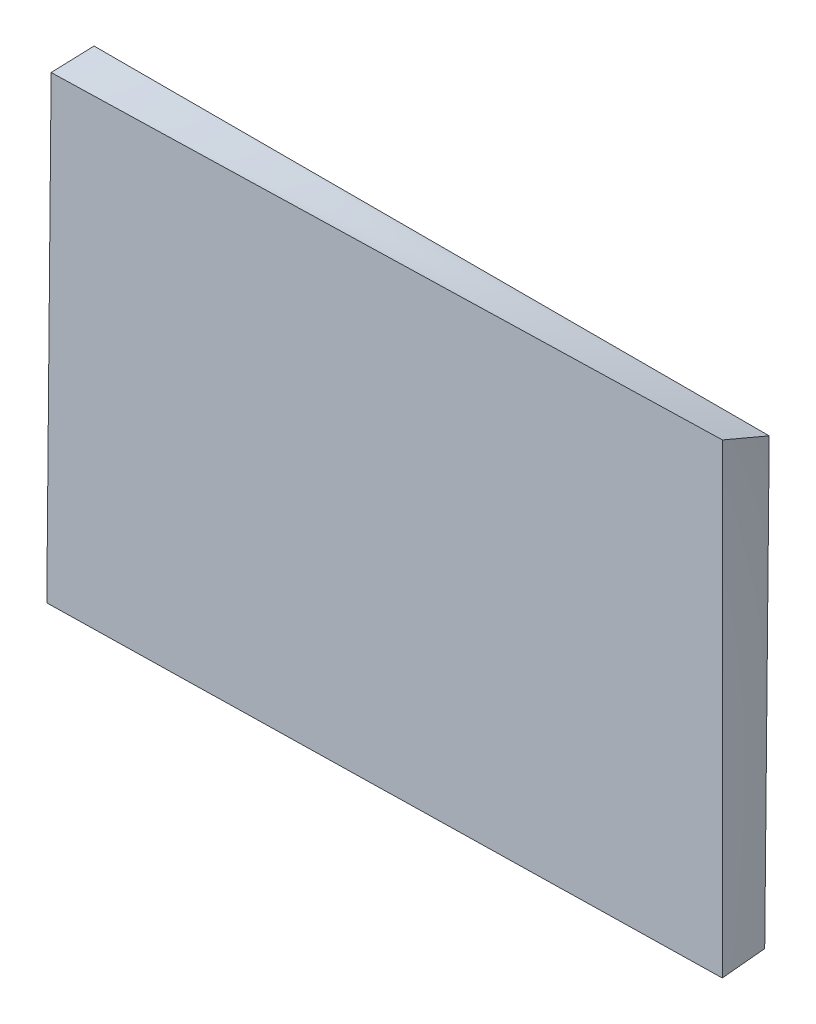
ISO-10303-21;
HEADER;
FILE_DESCRIPTION(('STEP AP214'),'2;1');
FILE_NAME('part.step','',(''),(''),'','','');
FILE_SCHEMA(('AUTOMOTIVE_DESIGN { 1 0 10303 214 1 1 1 1 }'));
ENDSEC;
DATA;
#1=APPLICATION_CONTEXT('core data for automotive mechanical design processes');
#2=APPLICATION_PROTOCOL_DEFINITION('international standard','automotive_design',2000,#1);
#3=PRODUCT_CONTEXT('',#1,'mechanical');
#4=PRODUCT('Part','Part','',(#3));
#5=PRODUCT_RELATED_PRODUCT_CATEGORY('part','',(#4));
#6=PRODUCT_DEFINITION_FORMATION('','',#4);
#7=PRODUCT_DEFINITION_CONTEXT('part definition',#1,'design');
#8=PRODUCT_DEFINITION('design','',#6,#7);
#9=PRODUCT_DEFINITION_SHAPE('','',#8);
#10=(LENGTH_UNIT() NAMED_UNIT(*) SI_UNIT(.MILLI.,.METRE.));
#11=(NAMED_UNIT(*) PLANE_ANGLE_UNIT() SI_UNIT($,.RADIAN.));
#12=(NAMED_UNIT(*) SI_UNIT($,.STERADIAN.) SOLID_ANGLE_UNIT());
#13=UNCERTAINTY_MEASURE_WITH_UNIT(LENGTH_MEASURE(1.E-05),#10,'distance_accuracy_value','');
#14=(GEOMETRIC_REPRESENTATION_CONTEXT(3) GLOBAL_UNCERTAINTY_ASSIGNED_CONTEXT((#13)) GLOBAL_UNIT_ASSIGNED_CONTEXT((#10,
#11,#12)) REPRESENTATION_CONTEXT('',''));
#15=CARTESIAN_POINT('',(0.,0.,0.));
#16=DIRECTION('',(0.,0.,1.));
#17=DIRECTION('',(1.,0.,0.));
#18=AXIS2_PLACEMENT_3D('',#15,#16,#17);
#19=CARTESIAN_POINT('',(0.,0.0697989934050091,1.99878165403819));
#20=DIRECTION('',(0.,0.0348994967025045,0.999390827019096));
#21=DIRECTION('',(0.,-0.999390827019096,0.0348994967025045));
#22=AXIS2_PLACEMENT_3D('',#19,#20,#21);
#23=PLANE('',#22);
#24=DIRECTION('',(0.999684026786742,0.0251212462704244,-0.000877253250355004));
#25=VECTOR('',#24,1.);
#26=CARTESIAN_POINT('',(14.6511823235174,10.4348141769099,1.63682734803652));
#27=LINE('',#26,#25);
#28=CARTESIAN_POINT('',(-15.2488176764825,9.68345150294578,1.66306551077872));
#29=VERTEX_POINT('',#28);
#30=CARTESIAN_POINT('',(14.6511823235174,10.4348141769099,1.63682734803652));
#31=VERTEX_POINT('',#30);
#32=EDGE_CURVE('E127',#29,#31,#27,.T.);
#33=ORIENTED_EDGE('',*,*,#32,.F.);
#34=DIRECTION('',(-0.0251365587828712,0.999075046288182,-0.0348884693963903));
#35=VECTOR('',#34,1.);
#36=CARTESIAN_POINT('',(-15.2488176764826,9.68345150294578,1.66306551077872));
#37=LINE('',#36,#35);
#38=CARTESIAN_POINT('',(-14.7486001567034,-10.198141918189,2.35734605176689));
#39=VERTEX_POINT('',#38);
#40=EDGE_CURVE('E125',#39,#29,#37,.T.);
#41=ORIENTED_EDGE('',*,*,#40,.F.);
#42=DIRECTION('',(-0.999828427454217,-0.0185120973469246,0.000646456684260813));
#43=VECTOR('',#42,1.);
#44=CARTESIAN_POINT('',(-14.7486001567034,-10.198141918189,2.35734605176689));
#45=LINE('',#44,#43);
#46=CARTESIAN_POINT('',(15.3462355096685,-9.6409277880466,2.33788770557064));
#47=VERTEX_POINT('',#46);
#48=EDGE_CURVE('E61',#47,#39,#45,.T.);
#49=ORIENTED_EDGE('',*,*,#48,.F.);
#50=DIRECTION('',(0.034579760505029,-0.9987931325849,0.0348786247529415));
#51=VECTOR('',#50,1.);
#52=CARTESIAN_POINT('',(15.3462355096685,-9.6409277880466,2.33788770557064));
#53=LINE('',#52,#51);
#54=EDGE_CURVE('E12',#31,#47,#53,.T.);
#55=ORIENTED_EDGE('',*,*,#54,.F.);
#56=EDGE_LOOP('',(#33,#41,#49,#55));
#57=FACE_BOUND('',#56,.T.);
#58=ADVANCED_FACE('F51',(#57),#23,.T.);
#59=CARTESIAN_POINT('',(0.,0.,0.));
#60=DIRECTION('',(0.,0.,1.));
#61=DIRECTION('',(1.,0.,0.));
#62=AXIS2_PLACEMENT_3D('',#59,#60,#61);
#63=PLANE('',#62);
#64=DIRECTION('',(-1.,0.,0.));
#65=VECTOR('',#64,1.);
#66=CARTESIAN_POINT('',(15.1001689223314,9.9997470367077,0.));
#67=LINE('',#66,#65);
#68=CARTESIAN_POINT('',(15.1001689223314,9.9997470367077,0.));
#69=VERTEX_POINT('',#68);
#70=CARTESIAN_POINT('',(-14.9998310776686,9.9997470367077,0.));
#71=VERTEX_POINT('',#70);
#72=EDGE_CURVE('E100',#69,#71,#67,.T.);
#73=ORIENTED_EDGE('',*,*,#72,.F.);
#74=DIRECTION('',(0.0100842054937449,0.999949153107077,0.));
#75=VECTOR('',#74,1.);
#76=CARTESIAN_POINT('',(14.8994932330058,-9.89924111012312,0.));
#77=LINE('',#76,#75);
#78=CARTESIAN_POINT('',(14.8994932330058,-9.89924111012312,0.));
#79=VERTEX_POINT('',#78);
#80=EDGE_CURVE('E226',#79,#69,#77,.T.);
#81=ORIENTED_EDGE('',*,*,#80,.F.);
#82=DIRECTION('',(0.999977401694796,0.00672280445381868,0.));
#83=VECTOR('',#82,1.);
#84=CARTESIAN_POINT('',(-14.9998310776686,-10.1002529632923,0.));
#85=LINE('',#84,#83);
#86=CARTESIAN_POINT('',(-14.9998310776686,-10.1002529632923,0.));
#87=VERTEX_POINT('',#86);
#88=EDGE_CURVE('E102',#87,#79,#85,.T.);
#89=ORIENTED_EDGE('',*,*,#88,.F.);
#90=DIRECTION('',(0.,-1.,0.));
#91=VECTOR('',#90,1.);
#92=CARTESIAN_POINT('',(-14.9998310776686,9.9997470367077,0.));
#93=LINE('',#92,#91);
#94=EDGE_CURVE('E96',#71,#87,#93,.T.);
#95=ORIENTED_EDGE('',*,*,#94,.F.);
#96=EDGE_LOOP('',(#73,#81,#89,#95));
#97=FACE_BOUND('',#96,.T.);
#98=ADVANCED_FACE('F99',(#97),#63,.F.);
#99=CARTESIAN_POINT('',(-14.9998310776686,-10.1002529632923,0.));
#100=CARTESIAN_POINT('',(-14.7486001567034,-10.198141918189,2.35734605176689));
#101=CARTESIAN_POINT('',(-10.0166103592228,-10.0667509877641,0.));
#102=CARTESIAN_POINT('',(-9.73279421230807,-10.1052728964986,2.35410299406751));
#103=CARTESIAN_POINT('',(-5.03338964077709,-10.0332490122359,0.));
#104=CARTESIAN_POINT('',(-4.71698826791273,-10.0124038748082,2.35085993636814));
#105=CARTESIAN_POINT('',(4.93305179611438,-9.96624506117951,0.));
#106=CARTESIAN_POINT('',(5.31462362087791,-9.82666583142741,2.34437382096939));
#107=CARTESIAN_POINT('',(9.9162725145601,-9.93274308565131,0.));
#108=CARTESIAN_POINT('',(10.3304295652732,-9.73379680973701,2.34113076327001));
#109=CARTESIAN_POINT('',(14.8994932330058,-9.89924111012312,0.));
#110=CARTESIAN_POINT('',(15.3462355096685,-9.6409277880466,2.33788770557064));
#111=B_SPLINE_SURFACE_WITH_KNOTS('',3,1,((#99,#100),(#101,#102),(#103,#104),(#105,#106),(#107,
#108),(#109,#110)),.UNSPECIFIED.,.F.,.F.,.F.,(4,2,4),(2,2),(0.,0.5,1.),(0.,1.),.UNSPECIFIED.);
#112=DIRECTION('',(0.186596321247656,0.107892890703808,0.97649420737269));
#113=VECTOR('',#112,1.);
#114=CARTESIAN_POINT('',(15.1228643713372,-9.77008444908486,1.16894385278532));
#115=LINE('',#114,#113);
#116=EDGE_CURVE('E76',#79,#47,#115,.T.);
#117=DIRECTION('',(-0.105883281584117,0.0412560831902713,-0.993522353186266));
#118=VECTOR('',#117,1.);
#119=CARTESIAN_POINT('',(-14.874215617186,-10.1491974407407,1.17867302588344));
#120=LINE('',#119,#118);
#121=EDGE_CURVE('E140',#39,#87,#120,.T.);
#122=ORIENTED_EDGE('',*,*,#88,.T.);
#123=ORIENTED_EDGE('',*,*,#116,.T.);
#124=ORIENTED_EDGE('',*,*,#48,.T.);
#125=ORIENTED_EDGE('',*,*,#121,.T.);
#126=EDGE_LOOP('',(#122,#123,#124,#125));
#127=FACE_BOUND('',#126,.T.);
#128=ADVANCED_FACE('F181',(#127),#111,.T.);
#129=CARTESIAN_POINT('',(14.8994932330058,-9.89924111012312,0.));
#130=CARTESIAN_POINT('',(15.3462355096685,-9.6409277880466,2.33788770557064));
#131=CARTESIAN_POINT('',(14.9329391812268,-6.58274308565131,0.));
#132=CARTESIAN_POINT('',(15.2303933119767,-6.29497079388718,2.22104431264829));
#133=CARTESIAN_POINT('',(14.9663851294477,-3.2662450611795,0.));
#134=CARTESIAN_POINT('',(15.1145511142848,-2.94901379972777,2.10420091972593));
#135=CARTESIAN_POINT('',(15.0332770258895,3.36675098776411,0.));
#136=CARTESIAN_POINT('',(14.8828667189011,3.74290018859107,1.87051413388122));
#137=CARTESIAN_POINT('',(15.0667229741104,6.68324901223591,0.));
#138=CARTESIAN_POINT('',(14.7670245212093,7.08885718275048,1.75367074095887));
#139=CARTESIAN_POINT('',(15.1001689223314,9.99974703670771,0.));
#140=CARTESIAN_POINT('',(14.6511823235174,10.4348141769099,1.63682734803652));
#141=B_SPLINE_SURFACE_WITH_KNOTS('',3,1,((#129,#130),(#131,#132),(#133,#134),(#135,#136),(#137,
#138),(#139,#140)),.UNSPECIFIED.,.F.,.F.,.F.,(4,2,4),(2,2),(0.,0.5,1.),(0.,1.),.UNSPECIFIED.);
#142=DIRECTION('',(-0.256247008870429,0.248302852755803,0.9341751247803));
#143=VECTOR('',#142,1.);
#144=CARTESIAN_POINT('',(14.8756756229244,10.2172806068088,0.818413674018258));
#145=LINE('',#144,#143);
#146=EDGE_CURVE('E118',#69,#31,#145,.T.);
#147=ORIENTED_EDGE('',*,*,#80,.T.);
#148=ORIENTED_EDGE('',*,*,#146,.T.);
#149=ORIENTED_EDGE('',*,*,#54,.T.);
#150=ORIENTED_EDGE('',*,*,#116,.F.);
#151=EDGE_LOOP('',(#147,#148,#149,#150));
#152=FACE_BOUND('',#151,.T.);
#153=ADVANCED_FACE('F152',(#152),#141,.T.);
#154=CARTESIAN_POINT('',(-14.9998310776686,9.9997470367077,0.));
#155=CARTESIAN_POINT('',(-15.2488176764826,9.68345150294578,1.66306551077872));
#156=CARTESIAN_POINT('',(-14.9998310776686,6.6497470367077,0.));
#157=CARTESIAN_POINT('',(-15.1654480898527,6.36985259942332,1.77877893427675));
#158=CARTESIAN_POINT('',(-14.9998310776686,3.2997470367077,0.));
#159=CARTESIAN_POINT('',(-15.0820785032228,3.05625369590086,1.89449235777478));
#160=CARTESIAN_POINT('',(-14.9998310776686,-3.4002529632923,0.));
#161=CARTESIAN_POINT('',(-14.9153393299631,-3.57094411114408,2.12591920477083));
#162=CARTESIAN_POINT('',(-14.9998310776686,-6.7502529632923,0.));
#163=CARTESIAN_POINT('',(-14.8319697433333,-6.88454301466655,2.24163262826886));
#164=CARTESIAN_POINT('',(-14.9998310776686,-10.1002529632923,0.));
#165=CARTESIAN_POINT('',(-14.7486001567034,-10.198141918189,2.35734605176689));
#166=B_SPLINE_SURFACE_WITH_KNOTS('',3,1,((#154,#155),(#156,#157),(#158,#159),(#160,#161),(#162,
#163),(#164,#165)),.UNSPECIFIED.,.F.,.F.,.F.,(4,2,4),(2,2),(0.,0.5,1.),(0.,1.),.UNSPECIFIED.);
#167=DIRECTION('',(-0.145513565815366,-0.184850474637671,0.971934207747585));
#168=VECTOR('',#167,1.);
#169=CARTESIAN_POINT('',(-15.1243243770756,9.84159926982674,0.831532755389361));
#170=LINE('',#169,#168);
#171=EDGE_CURVE('E116',#71,#29,#170,.T.);
#172=ORIENTED_EDGE('',*,*,#94,.T.);
#173=ORIENTED_EDGE('',*,*,#121,.F.);
#174=ORIENTED_EDGE('',*,*,#40,.T.);
#175=ORIENTED_EDGE('',*,*,#171,.F.);
#176=EDGE_LOOP('',(#172,#173,#174,#175));
#177=FACE_BOUND('',#176,.T.);
#178=ADVANCED_FACE('F123',(#177),#166,.T.);
#179=CARTESIAN_POINT('',(15.1001689223314,9.9997470367077,0.));
#180=CARTESIAN_POINT('',(14.6511823235174,10.4348141769099,1.63682734803652));
#181=CARTESIAN_POINT('',(10.0835022556647,9.9997470367077,0.));
#182=CARTESIAN_POINT('',(9.66784899018411,10.3095870645825,1.64120037516022));
#183=CARTESIAN_POINT('',(5.06683558899805,9.9997470367077,0.));
#184=CARTESIAN_POINT('',(4.68451565685077,10.1843599522552,1.64557340228392));
#185=CARTESIAN_POINT('',(-4.96649774433528,9.9997470367077,0.));
#186=CARTESIAN_POINT('',(-5.28215100981589,9.93390572760049,1.65431945653132));
#187=CARTESIAN_POINT('',(-9.98316441100195,9.9997470367077,0.));
#188=CARTESIAN_POINT('',(-10.2654843431492,9.80867861527314,1.65869248365502));
#189=CARTESIAN_POINT('',(-14.9998310776686,9.9997470367077,0.));
#190=CARTESIAN_POINT('',(-15.2488176764825,9.68345150294578,1.66306551077872));
#191=B_SPLINE_SURFACE_WITH_KNOTS('',3,1,((#179,#180),(#181,#182),(#183,#184),(#185,#186),(#187,
#188),(#189,#190)),.UNSPECIFIED.,.F.,.F.,.F.,(4,2,4),(2,2),(0.,0.5,1.),(0.,1.),.UNSPECIFIED.);
#192=ORIENTED_EDGE('',*,*,#72,.T.);
#193=ORIENTED_EDGE('',*,*,#171,.T.);
#194=ORIENTED_EDGE('',*,*,#32,.T.);
#195=ORIENTED_EDGE('',*,*,#146,.F.);
#196=EDGE_LOOP('',(#192,#193,#194,#195));
#197=FACE_BOUND('',#196,.T.);
#198=ADVANCED_FACE('F115',(#197),#191,.T.);
#199=CLOSED_SHELL('',(#58,#98,#128,#153,#178,#198));
#200=MANIFOLD_SOLID_BREP('B2',#199);
#201=ADVANCED_BREP_SHAPE_REPRESENTATION('',(#18,#200),#14);
#202=SHAPE_DEFINITION_REPRESENTATION(#9,#201);
ENDSEC;
END-ISO-10303-21;
